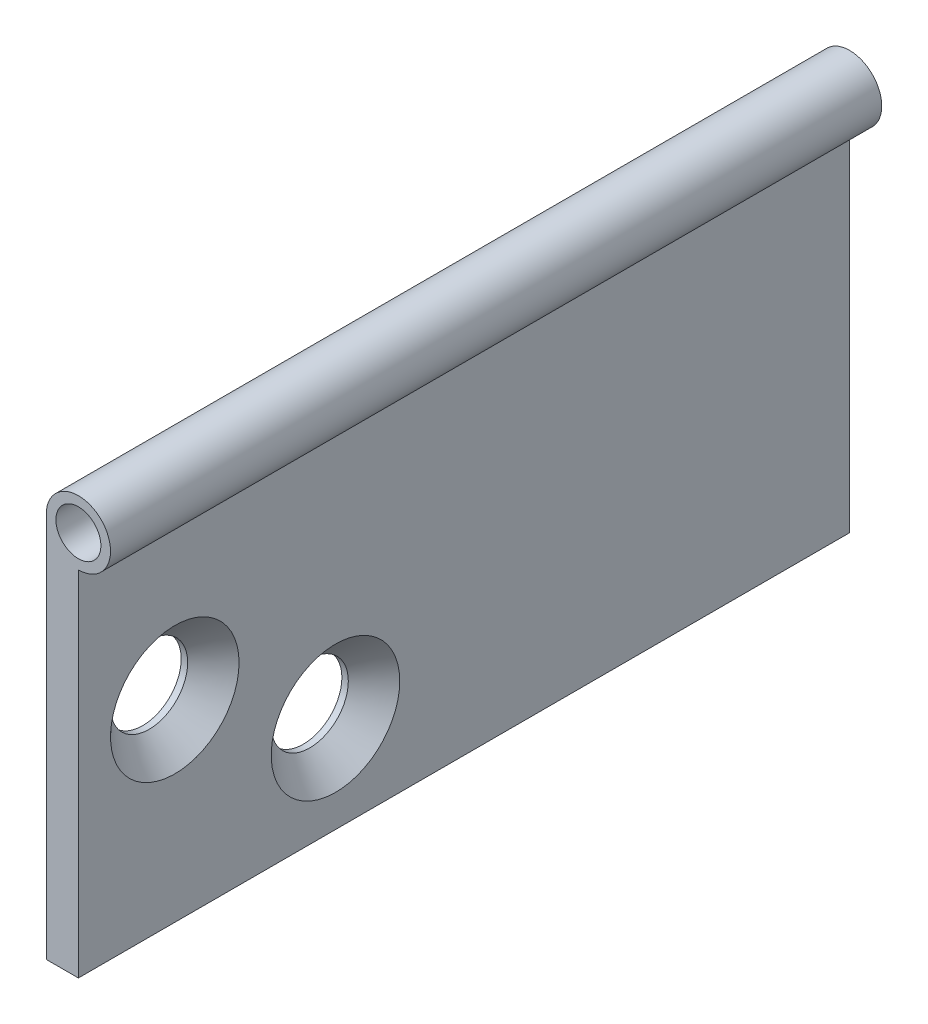
ISO-10303-21;
HEADER;
FILE_DESCRIPTION(('STEP AP214'),'2;1');
FILE_NAME('part.step','',(''),(''),'','','');
FILE_SCHEMA(('AUTOMOTIVE_DESIGN { 1 0 10303 214 1 1 1 1 }'));
ENDSEC;
DATA;
#1=APPLICATION_CONTEXT('core data for automotive mechanical design processes');
#2=APPLICATION_PROTOCOL_DEFINITION('international standard','automotive_design',2000,#1);
#3=PRODUCT_CONTEXT('',#1,'mechanical');
#4=PRODUCT('Part','Part','',(#3));
#5=PRODUCT_RELATED_PRODUCT_CATEGORY('part','',(#4));
#6=PRODUCT_DEFINITION_FORMATION('','',#4);
#7=PRODUCT_DEFINITION_CONTEXT('part definition',#1,'design');
#8=PRODUCT_DEFINITION('design','',#6,#7);
#9=PRODUCT_DEFINITION_SHAPE('','',#8);
#10=(LENGTH_UNIT() NAMED_UNIT(*) SI_UNIT(.MILLI.,.METRE.));
#11=(NAMED_UNIT(*) PLANE_ANGLE_UNIT() SI_UNIT($,.RADIAN.));
#12=(NAMED_UNIT(*) SI_UNIT($,.STERADIAN.) SOLID_ANGLE_UNIT());
#13=UNCERTAINTY_MEASURE_WITH_UNIT(LENGTH_MEASURE(1.E-05),#10,'distance_accuracy_value','');
#14=(GEOMETRIC_REPRESENTATION_CONTEXT(3) GLOBAL_UNCERTAINTY_ASSIGNED_CONTEXT((#13)) GLOBAL_UNIT_ASSIGNED_CONTEXT((#10,
#11,#12)) REPRESENTATION_CONTEXT('',''));
#15=CARTESIAN_POINT('',(0.,0.,0.));
#16=DIRECTION('',(0.,0.,1.));
#17=DIRECTION('',(1.,0.,0.));
#18=AXIS2_PLACEMENT_3D('',#15,#16,#17);
#19=CARTESIAN_POINT('',(5.,0.,60.));
#20=DIRECTION('',(-1.,0.,0.));
#21=DIRECTION('',(0.,0.,1.));
#22=AXIS2_PLACEMENT_3D('',#19,#20,#21);
#23=PLANE('',#22);
#24=CARTESIAN_POINT('',(5.,30.,45.));
#25=DIRECTION('',(1.,0.,0.));
#26=DIRECTION('',(0.,0.,-1.));
#27=AXIS2_PLACEMENT_3D('',#24,#25,#26);
#28=CIRCLE('',#27,10.);
#29=CARTESIAN_POINT('',(5.,30.,35.));
#30=VERTEX_POINT('',#29);
#31=EDGE_CURVE('E125',#30,#30,#28,.T.);
#32=ORIENTED_EDGE('',*,*,#31,.F.);
#33=EDGE_LOOP('',(#32));
#34=FACE_BOUND('',#33,.T.);
#35=CARTESIAN_POINT('',(5.,15.,20.));
#36=DIRECTION('',(1.,0.,0.));
#37=DIRECTION('',(0.,0.,-1.));
#38=AXIS2_PLACEMENT_3D('',#35,#36,#37);
#39=CIRCLE('',#38,10.);
#40=CARTESIAN_POINT('',(5.,15.,9.99999999999999));
#41=VERTEX_POINT('',#40);
#42=EDGE_CURVE('E128',#41,#41,#39,.T.);
#43=ORIENTED_EDGE('',*,*,#42,.F.);
#44=EDGE_LOOP('',(#43));
#45=FACE_BOUND('',#44,.T.);
#46=DIRECTION('',(0.,0.,-1.));
#47=VECTOR('',#46,1.);
#48=CARTESIAN_POINT('',(5.,55.,60.));
#49=LINE('',#48,#47);
#50=CARTESIAN_POINT('',(5.,55.,60.));
#51=VERTEX_POINT('',#50);
#52=CARTESIAN_POINT('',(5.,55.,-60.));
#53=VERTEX_POINT('',#52);
#54=EDGE_CURVE('E49',#51,#53,#49,.T.);
#55=ORIENTED_EDGE('',*,*,#54,.F.);
#56=DIRECTION('',(0.,1.,0.));
#57=VECTOR('',#56,1.);
#58=CARTESIAN_POINT('',(5.,0.,60.));
#59=LINE('',#58,#57);
#60=CARTESIAN_POINT('',(5.,0.,60.));
#61=VERTEX_POINT('',#60);
#62=EDGE_CURVE('E104',#61,#51,#59,.T.);
#63=ORIENTED_EDGE('',*,*,#62,.F.);
#64=DIRECTION('',(0.,0.,-1.));
#65=VECTOR('',#64,1.);
#66=CARTESIAN_POINT('',(5.,0.,60.));
#67=LINE('',#66,#65);
#68=CARTESIAN_POINT('',(5.,0.,-60.));
#69=VERTEX_POINT('',#68);
#70=EDGE_CURVE('E58',#61,#69,#67,.T.);
#71=ORIENTED_EDGE('',*,*,#70,.T.);
#72=DIRECTION('',(0.,1.,0.));
#73=VECTOR('',#72,1.);
#74=CARTESIAN_POINT('',(5.,0.,-60.));
#75=LINE('',#74,#73);
#76=EDGE_CURVE('E99',#69,#53,#75,.T.);
#77=ORIENTED_EDGE('',*,*,#76,.T.);
#78=EDGE_LOOP('',(#55,#63,#71,#77));
#79=FACE_BOUND('',#78,.T.);
#80=ADVANCED_FACE('F35',(#34,#45,#79),#23,.F.);
#81=CARTESIAN_POINT('',(0.,0.,60.));
#82=DIRECTION('',(-1.,0.,0.));
#83=DIRECTION('',(0.,0.,1.));
#84=AXIS2_PLACEMENT_3D('',#81,#82,#83);
#85=PLANE('',#84);
#86=CARTESIAN_POINT('',(0.,30.,45.));
#87=DIRECTION('',(1.,0.,0.));
#88=DIRECTION('',(0.,0.,-1.));
#89=AXIS2_PLACEMENT_3D('',#86,#87,#88);
#90=CIRCLE('',#89,6.);
#91=CARTESIAN_POINT('',(0.,30.,39.));
#92=VERTEX_POINT('',#91);
#93=EDGE_CURVE('E131',#92,#92,#90,.T.);
#94=ORIENTED_EDGE('',*,*,#93,.T.);
#95=EDGE_LOOP('',(#94));
#96=FACE_BOUND('',#95,.T.);
#97=CARTESIAN_POINT('',(0.,15.,20.));
#98=DIRECTION('',(1.,0.,0.));
#99=DIRECTION('',(0.,0.,-1.));
#100=AXIS2_PLACEMENT_3D('',#97,#98,#99);
#101=CIRCLE('',#100,6.);
#102=CARTESIAN_POINT('',(0.,15.,14.));
#103=VERTEX_POINT('',#102);
#104=EDGE_CURVE('E134',#103,#103,#101,.T.);
#105=ORIENTED_EDGE('',*,*,#104,.T.);
#106=EDGE_LOOP('',(#105));
#107=FACE_BOUND('',#106,.T.);
#108=DIRECTION('',(0.,1.,0.));
#109=VECTOR('',#108,1.);
#110=CARTESIAN_POINT('',(0.,0.,-60.));
#111=LINE('',#110,#109);
#112=CARTESIAN_POINT('',(0.,0.,-60.));
#113=VERTEX_POINT('',#112);
#114=CARTESIAN_POINT('',(0.,60.,-60.));
#115=VERTEX_POINT('',#114);
#116=EDGE_CURVE('E98',#113,#115,#111,.T.);
#117=ORIENTED_EDGE('',*,*,#116,.F.);
#118=DIRECTION('',(0.,0.,-1.));
#119=VECTOR('',#118,1.);
#120=CARTESIAN_POINT('',(0.,0.,60.));
#121=LINE('',#120,#119);
#122=CARTESIAN_POINT('',(0.,0.,60.));
#123=VERTEX_POINT('',#122);
#124=EDGE_CURVE('E42',#123,#113,#121,.T.);
#125=ORIENTED_EDGE('',*,*,#124,.F.);
#126=DIRECTION('',(0.,1.,0.));
#127=VECTOR('',#126,1.);
#128=CARTESIAN_POINT('',(0.,0.,60.));
#129=LINE('',#128,#127);
#130=CARTESIAN_POINT('',(0.,60.,60.));
#131=VERTEX_POINT('',#130);
#132=EDGE_CURVE('E74',#123,#131,#129,.T.);
#133=ORIENTED_EDGE('',*,*,#132,.T.);
#134=DIRECTION('',(0.,0.,-1.));
#135=VECTOR('',#134,1.);
#136=CARTESIAN_POINT('',(0.,60.,60.));
#137=LINE('',#136,#135);
#138=EDGE_CURVE('E11',#131,#115,#137,.T.);
#139=ORIENTED_EDGE('',*,*,#138,.T.);
#140=EDGE_LOOP('',(#117,#125,#133,#139));
#141=FACE_BOUND('',#140,.T.);
#142=ADVANCED_FACE('F115',(#96,#107,#141),#85,.T.);
#143=CARTESIAN_POINT('',(5.,0.,60.));
#144=DIRECTION('',(0.,-1.,0.));
#145=DIRECTION('',(0.,0.,-1.));
#146=AXIS2_PLACEMENT_3D('',#143,#144,#145);
#147=PLANE('',#146);
#148=DIRECTION('',(-1.,0.,0.));
#149=VECTOR('',#148,1.);
#150=CARTESIAN_POINT('',(5.,0.,-60.));
#151=LINE('',#150,#149);
#152=EDGE_CURVE('E106',#69,#113,#151,.T.);
#153=ORIENTED_EDGE('',*,*,#152,.F.);
#154=ORIENTED_EDGE('',*,*,#70,.F.);
#155=DIRECTION('',(-1.,0.,0.));
#156=VECTOR('',#155,1.);
#157=CARTESIAN_POINT('',(5.,0.,60.));
#158=LINE('',#157,#156);
#159=EDGE_CURVE('E108',#61,#123,#158,.T.);
#160=ORIENTED_EDGE('',*,*,#159,.T.);
#161=ORIENTED_EDGE('',*,*,#124,.T.);
#162=EDGE_LOOP('',(#153,#154,#160,#161));
#163=FACE_BOUND('',#162,.T.);
#164=ADVANCED_FACE('F113',(#163),#147,.T.);
#165=CARTESIAN_POINT('',(0.,0.,60.));
#166=DIRECTION('',(0.,0.,-1.));
#167=DIRECTION('',(-1.,0.,0.));
#168=AXIS2_PLACEMENT_3D('',#165,#166,#167);
#169=PLANE('',#168);
#170=CARTESIAN_POINT('',(5.,60.,60.));
#171=DIRECTION('',(0.,0.,1.));
#172=DIRECTION('',(1.,0.,0.));
#173=AXIS2_PLACEMENT_3D('',#170,#171,#172);
#174=CIRCLE('',#173,3.5);
#175=CARTESIAN_POINT('',(8.5,60.,60.));
#176=VERTEX_POINT('',#175);
#177=EDGE_CURVE('E143',#176,#176,#174,.T.);
#178=ORIENTED_EDGE('',*,*,#177,.F.);
#179=EDGE_LOOP('',(#178));
#180=FACE_BOUND('',#179,.T.);
#181=ORIENTED_EDGE('',*,*,#62,.T.);
#182=CARTESIAN_POINT('',(5.,60.,60.));
#183=DIRECTION('',(0.,0.,1.));
#184=DIRECTION('',(1.,0.,0.));
#185=AXIS2_PLACEMENT_3D('',#182,#183,#184);
#186=CIRCLE('',#185,5.);
#187=CARTESIAN_POINT('',(10.,60.,60.));
#188=VERTEX_POINT('',#187);
#189=EDGE_CURVE('E146',#51,#188,#186,.T.);
#190=ORIENTED_EDGE('',*,*,#189,.T.);
#191=EDGE_CURVE('E92',#188,#131,#186,.T.);
#192=ORIENTED_EDGE('',*,*,#191,.T.);
#193=ORIENTED_EDGE('',*,*,#132,.F.);
#194=ORIENTED_EDGE('',*,*,#159,.F.);
#195=EDGE_LOOP('',(#181,#190,#192,#193,#194));
#196=FACE_BOUND('',#195,.T.);
#197=ADVANCED_FACE('F152',(#180,#196),#169,.F.);
#198=CARTESIAN_POINT('',(0.,0.,-60.));
#199=DIRECTION('',(0.,0.,-1.));
#200=DIRECTION('',(-1.,0.,0.));
#201=AXIS2_PLACEMENT_3D('',#198,#199,#200);
#202=PLANE('',#201);
#203=CARTESIAN_POINT('',(5.,60.,-60.));
#204=DIRECTION('',(0.,0.,1.));
#205=DIRECTION('',(1.,0.,0.));
#206=AXIS2_PLACEMENT_3D('',#203,#204,#205);
#207=CIRCLE('',#206,3.5);
#208=CARTESIAN_POINT('',(8.5,60.,-60.));
#209=VERTEX_POINT('',#208);
#210=EDGE_CURVE('E144',#209,#209,#207,.T.);
#211=ORIENTED_EDGE('',*,*,#210,.T.);
#212=EDGE_LOOP('',(#211));
#213=FACE_BOUND('',#212,.T.);
#214=ORIENTED_EDGE('',*,*,#116,.T.);
#215=CARTESIAN_POINT('',(5.,60.,-60.));
#216=DIRECTION('',(0.,0.,1.));
#217=DIRECTION('',(1.,0.,0.));
#218=AXIS2_PLACEMENT_3D('',#215,#216,#217);
#219=CIRCLE('',#218,5.);
#220=CARTESIAN_POINT('',(10.,60.,-60.));
#221=VERTEX_POINT('',#220);
#222=EDGE_CURVE('E89',#221,#115,#219,.T.);
#223=ORIENTED_EDGE('',*,*,#222,.F.);
#224=EDGE_CURVE('E86',#53,#221,#219,.T.);
#225=ORIENTED_EDGE('',*,*,#224,.F.);
#226=ORIENTED_EDGE('',*,*,#76,.F.);
#227=ORIENTED_EDGE('',*,*,#152,.T.);
#228=EDGE_LOOP('',(#214,#223,#225,#226,#227));
#229=FACE_BOUND('',#228,.T.);
#230=ADVANCED_FACE('F95',(#213,#229),#202,.T.);
#231=CARTESIAN_POINT('',(5.,60.,60.));
#232=DIRECTION('',(0.,0.,-1.));
#233=DIRECTION('',(-1.,0.,0.));
#234=AXIS2_PLACEMENT_3D('',#231,#232,#233);
#235=CYLINDRICAL_SURFACE('',#234,5.);
#236=ORIENTED_EDGE('',*,*,#138,.F.);
#237=ORIENTED_EDGE('',*,*,#191,.F.);
#238=ORIENTED_EDGE('',*,*,#189,.F.);
#239=ORIENTED_EDGE('',*,*,#54,.T.);
#240=ORIENTED_EDGE('',*,*,#224,.T.);
#241=ORIENTED_EDGE('',*,*,#222,.T.);
#242=EDGE_LOOP('',(#236,#237,#238,#239,#240,#241));
#243=FACE_BOUND('',#242,.T.);
#244=ADVANCED_FACE('F88',(#243),#235,.T.);
#245=CARTESIAN_POINT('',(5.,60.,-60.));
#246=DIRECTION('',(0.,0.,1.));
#247=DIRECTION('',(1.,0.,0.));
#248=AXIS2_PLACEMENT_3D('',#245,#246,#247);
#249=CYLINDRICAL_SURFACE('',#248,3.5);
#250=ORIENTED_EDGE('',*,*,#210,.F.);
#251=EDGE_LOOP('',(#250));
#252=FACE_BOUND('',#251,.T.);
#253=ORIENTED_EDGE('',*,*,#177,.T.);
#254=EDGE_LOOP('',(#253));
#255=FACE_BOUND('',#254,.T.);
#256=ADVANCED_FACE('F150',(#252,#255),#249,.F.);
#257=CARTESIAN_POINT('',(5.,15.,20.));
#258=DIRECTION('',(1.,0.,0.));
#259=DIRECTION('',(0.,0.,-1.));
#260=AXIS2_PLACEMENT_3D('',#257,#258,#259);
#261=CYLINDRICAL_SURFACE('',#260,6.);
#262=ORIENTED_EDGE('',*,*,#104,.F.);
#263=EDGE_LOOP('',(#262));
#264=FACE_BOUND('',#263,.T.);
#265=CARTESIAN_POINT('',(1.,15.,20.));
#266=DIRECTION('',(1.,0.,0.));
#267=DIRECTION('',(0.,0.,-1.));
#268=AXIS2_PLACEMENT_3D('',#265,#266,#267);
#269=CIRCLE('',#268,6.);
#270=CARTESIAN_POINT('',(1.,15.,14.));
#271=VERTEX_POINT('',#270);
#272=EDGE_CURVE('E130',#271,#271,#269,.T.);
#273=ORIENTED_EDGE('',*,*,#272,.T.);
#274=EDGE_LOOP('',(#273));
#275=FACE_BOUND('',#274,.T.);
#276=ADVANCED_FACE('F170',(#264,#275),#261,.F.);
#277=CARTESIAN_POINT('',(5.,15.,20.));
#278=DIRECTION('',(1.,0.,0.));
#279=DIRECTION('',(0.,0.,-1.));
#280=AXIS2_PLACEMENT_3D('',#277,#278,#279);
#281=CONICAL_SURFACE('',#280,10.,0.785398163397449);
#282=ORIENTED_EDGE('',*,*,#272,.F.);
#283=EDGE_LOOP('',(#282));
#284=FACE_BOUND('',#283,.T.);
#285=ORIENTED_EDGE('',*,*,#42,.T.);
#286=EDGE_LOOP('',(#285));
#287=FACE_BOUND('',#286,.T.);
#288=ADVANCED_FACE('F174',(#284,#287),#281,.F.);
#289=CARTESIAN_POINT('',(5.,30.,45.));
#290=DIRECTION('',(1.,0.,0.));
#291=DIRECTION('',(0.,0.,-1.));
#292=AXIS2_PLACEMENT_3D('',#289,#290,#291);
#293=CYLINDRICAL_SURFACE('',#292,6.);
#294=ORIENTED_EDGE('',*,*,#93,.F.);
#295=EDGE_LOOP('',(#294));
#296=FACE_BOUND('',#295,.T.);
#297=CARTESIAN_POINT('',(1.,30.,45.));
#298=DIRECTION('',(1.,0.,0.));
#299=DIRECTION('',(0.,0.,-1.));
#300=AXIS2_PLACEMENT_3D('',#297,#298,#299);
#301=CIRCLE('',#300,6.);
#302=CARTESIAN_POINT('',(1.,30.,39.));
#303=VERTEX_POINT('',#302);
#304=EDGE_CURVE('E137',#303,#303,#301,.T.);
#305=ORIENTED_EDGE('',*,*,#304,.T.);
#306=EDGE_LOOP('',(#305));
#307=FACE_BOUND('',#306,.T.);
#308=ADVANCED_FACE('F178',(#296,#307),#293,.F.);
#309=CARTESIAN_POINT('',(5.,30.,45.));
#310=DIRECTION('',(1.,0.,0.));
#311=DIRECTION('',(0.,0.,-1.));
#312=AXIS2_PLACEMENT_3D('',#309,#310,#311);
#313=CONICAL_SURFACE('',#312,10.,0.785398163397449);
#314=ORIENTED_EDGE('',*,*,#304,.F.);
#315=EDGE_LOOP('',(#314));
#316=FACE_BOUND('',#315,.T.);
#317=ORIENTED_EDGE('',*,*,#31,.T.);
#318=EDGE_LOOP('',(#317));
#319=FACE_BOUND('',#318,.T.);
#320=ADVANCED_FACE('F182',(#316,#319),#313,.F.);
#321=CLOSED_SHELL('',(#80,#142,#164,#197,#230,#244,#256,#276,#288,#308,#320));
#322=MANIFOLD_SOLID_BREP('B2',#321);
#323=ADVANCED_BREP_SHAPE_REPRESENTATION('',(#18,#322),#14);
#324=SHAPE_DEFINITION_REPRESENTATION(#9,#323);
ENDSEC;
END-ISO-10303-21;
